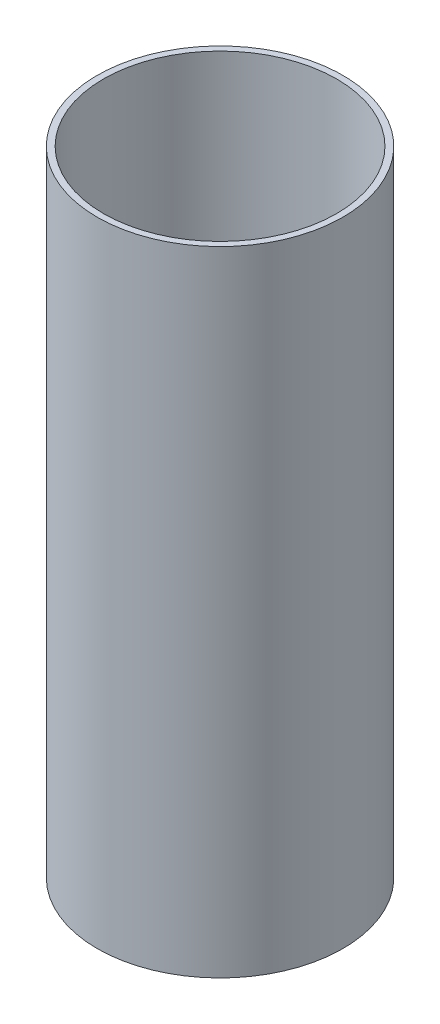
ISO-10303-21;
HEADER;
FILE_DESCRIPTION(('STEP AP214'),'2;1');
FILE_NAME('part.step','',(''),(''),'','','');
FILE_SCHEMA(('AUTOMOTIVE_DESIGN { 1 0 10303 214 1 1 1 1 }'));
ENDSEC;
DATA;
#1=APPLICATION_CONTEXT('core data for automotive mechanical design processes');
#2=APPLICATION_PROTOCOL_DEFINITION('international standard','automotive_design',2000,#1);
#3=PRODUCT_CONTEXT('',#1,'mechanical');
#4=PRODUCT('Part','Part','',(#3));
#5=PRODUCT_RELATED_PRODUCT_CATEGORY('part','',(#4));
#6=PRODUCT_DEFINITION_FORMATION('','',#4);
#7=PRODUCT_DEFINITION_CONTEXT('part definition',#1,'design');
#8=PRODUCT_DEFINITION('design','',#6,#7);
#9=PRODUCT_DEFINITION_SHAPE('','',#8);
#10=(LENGTH_UNIT() NAMED_UNIT(*) SI_UNIT(.MILLI.,.METRE.));
#11=(NAMED_UNIT(*) PLANE_ANGLE_UNIT() SI_UNIT($,.RADIAN.));
#12=(NAMED_UNIT(*) SI_UNIT($,.STERADIAN.) SOLID_ANGLE_UNIT());
#13=UNCERTAINTY_MEASURE_WITH_UNIT(LENGTH_MEASURE(1.E-05),#10,'distance_accuracy_value','');
#14=(GEOMETRIC_REPRESENTATION_CONTEXT(3) GLOBAL_UNCERTAINTY_ASSIGNED_CONTEXT((#13)) GLOBAL_UNIT_ASSIGNED_CONTEXT((#10,
#11,#12)) REPRESENTATION_CONTEXT('',''));
#15=CARTESIAN_POINT('',(0.,0.,0.));
#16=DIRECTION('',(0.,0.,1.));
#17=DIRECTION('',(1.,0.,0.));
#18=AXIS2_PLACEMENT_3D('',#15,#16,#17);
#19=CARTESIAN_POINT('',(0.,241.427,0.));
#20=DIRECTION('',(0.,1.,0.));
#21=DIRECTION('',(0.,0.,1.));
#22=AXIS2_PLACEMENT_3D('',#19,#20,#21);
#23=PLANE('',#22);
#24=CARTESIAN_POINT('',(0.,241.427,0.));
#25=DIRECTION('',(0.,1.,0.));
#26=DIRECTION('',(0.,0.,1.));
#27=AXIS2_PLACEMENT_3D('',#24,#25,#26);
#28=CIRCLE('',#27,93.6625);
#29=CARTESIAN_POINT('',(0.,241.427,93.6625));
#30=VERTEX_POINT('',#29);
#31=EDGE_CURVE('E10',#30,#30,#28,.T.);
#32=ORIENTED_EDGE('',*,*,#31,.T.);
#33=EDGE_LOOP('',(#32));
#34=FACE_BOUND('',#33,.T.);
#35=CARTESIAN_POINT('',(0.,241.427,0.));
#36=DIRECTION('',(0.,1.,0.));
#37=DIRECTION('',(0.,0.,1.));
#38=AXIS2_PLACEMENT_3D('',#35,#36,#37);
#39=CIRCLE('',#38,88.9);
#40=CARTESIAN_POINT('',(0.,241.427,88.9));
#41=VERTEX_POINT('',#40);
#42=EDGE_CURVE('E52',#41,#41,#39,.T.);
#43=ORIENTED_EDGE('',*,*,#42,.F.);
#44=EDGE_LOOP('',(#43));
#45=FACE_BOUND('',#44,.T.);
#46=ADVANCED_FACE('F41',(#34,#45),#23,.T.);
#47=CARTESIAN_POINT('',(0.,-241.427,0.));
#48=DIRECTION('',(0.,1.,0.));
#49=DIRECTION('',(0.,0.,1.));
#50=AXIS2_PLACEMENT_3D('',#47,#48,#49);
#51=PLANE('',#50);
#52=CARTESIAN_POINT('',(0.,-241.427,0.));
#53=DIRECTION('',(0.,1.,0.));
#54=DIRECTION('',(0.,0.,1.));
#55=AXIS2_PLACEMENT_3D('',#52,#53,#54);
#56=CIRCLE('',#55,93.6625);
#57=CARTESIAN_POINT('',(0.,-241.427,93.6625));
#58=VERTEX_POINT('',#57);
#59=EDGE_CURVE('E45',#58,#58,#56,.T.);
#60=ORIENTED_EDGE('',*,*,#59,.F.);
#61=EDGE_LOOP('',(#60));
#62=FACE_BOUND('',#61,.T.);
#63=CARTESIAN_POINT('',(0.,-241.427,0.));
#64=DIRECTION('',(0.,1.,0.));
#65=DIRECTION('',(0.,0.,1.));
#66=AXIS2_PLACEMENT_3D('',#63,#64,#65);
#67=CIRCLE('',#66,88.9);
#68=CARTESIAN_POINT('',(0.,-241.427,88.9));
#69=VERTEX_POINT('',#68);
#70=EDGE_CURVE('E54',#69,#69,#67,.T.);
#71=ORIENTED_EDGE('',*,*,#70,.T.);
#72=EDGE_LOOP('',(#71));
#73=FACE_BOUND('',#72,.T.);
#74=ADVANCED_FACE('F64',(#62,#73),#51,.F.);
#75=CARTESIAN_POINT('',(0.,241.427,0.));
#76=DIRECTION('',(0.,-1.,0.));
#77=DIRECTION('',(0.,0.,-1.));
#78=AXIS2_PLACEMENT_3D('',#75,#76,#77);
#79=CYLINDRICAL_SURFACE('',#78,93.6625);
#80=ORIENTED_EDGE('',*,*,#31,.F.);
#81=EDGE_LOOP('',(#80));
#82=FACE_BOUND('',#81,.T.);
#83=ORIENTED_EDGE('',*,*,#59,.T.);
#84=EDGE_LOOP('',(#83));
#85=FACE_BOUND('',#84,.T.);
#86=ADVANCED_FACE('F43',(#82,#85),#79,.T.);
#87=CARTESIAN_POINT('',(0.,241.427,0.));
#88=DIRECTION('',(0.,-1.,0.));
#89=DIRECTION('',(0.,0.,-1.));
#90=AXIS2_PLACEMENT_3D('',#87,#88,#89);
#91=CYLINDRICAL_SURFACE('',#90,88.9);
#92=ORIENTED_EDGE('',*,*,#42,.T.);
#93=EDGE_LOOP('',(#92));
#94=FACE_BOUND('',#93,.T.);
#95=ORIENTED_EDGE('',*,*,#70,.F.);
#96=EDGE_LOOP('',(#95));
#97=FACE_BOUND('',#96,.T.);
#98=ADVANCED_FACE('F60',(#94,#97),#91,.F.);
#99=CLOSED_SHELL('',(#46,#74,#86,#98));
#100=MANIFOLD_SOLID_BREP('B2',#99);
#101=ADVANCED_BREP_SHAPE_REPRESENTATION('',(#18,#100),#14);
#102=SHAPE_DEFINITION_REPRESENTATION(#9,#101);
ENDSEC;
END-ISO-10303-21;
